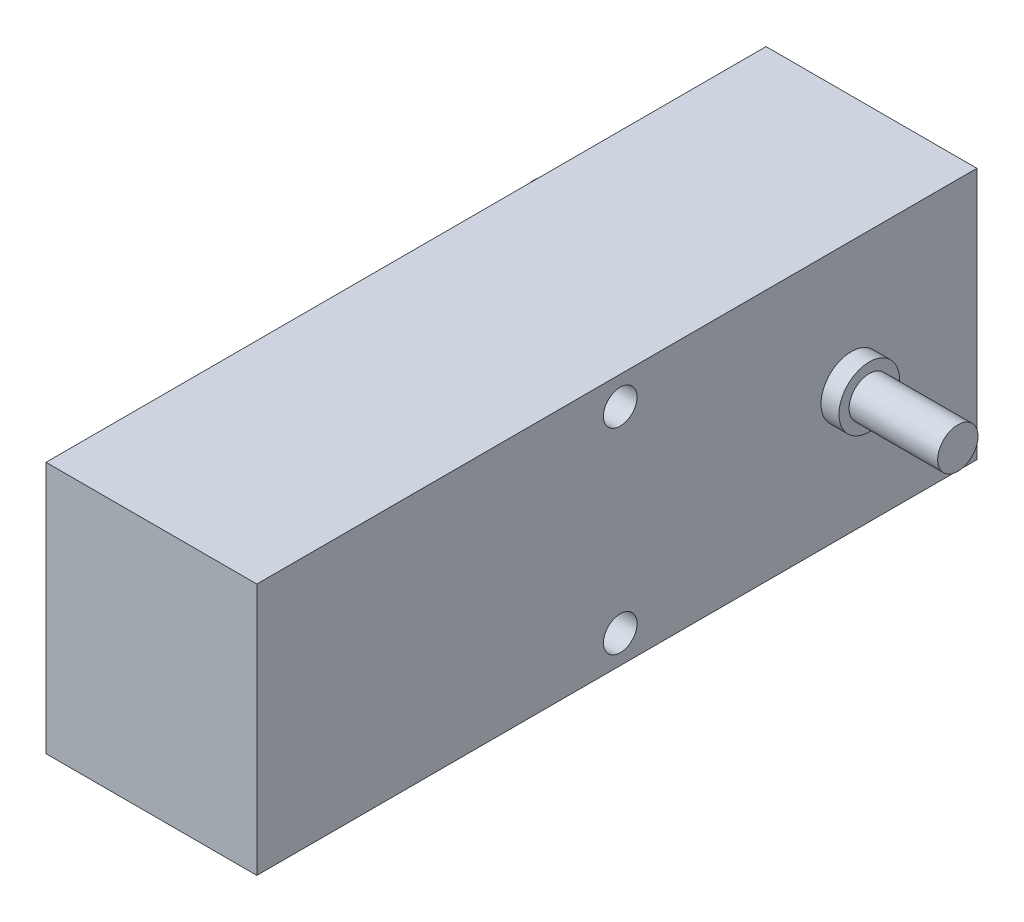
ISO-10303-21;
HEADER;
FILE_DESCRIPTION(('STEP AP214'),'2;1');
FILE_NAME('part.step','',(''),(''),'','','');
FILE_SCHEMA(('AUTOMOTIVE_DESIGN { 1 0 10303 214 1 1 1 1 }'));
ENDSEC;
DATA;
#1=APPLICATION_CONTEXT('core data for automotive mechanical design processes');
#2=APPLICATION_PROTOCOL_DEFINITION('international standard','automotive_design',2000,#1);
#3=PRODUCT_CONTEXT('',#1,'mechanical');
#4=PRODUCT('Part','Part','',(#3));
#5=PRODUCT_RELATED_PRODUCT_CATEGORY('part','',(#4));
#6=PRODUCT_DEFINITION_FORMATION('','',#4);
#7=PRODUCT_DEFINITION_CONTEXT('part definition',#1,'design');
#8=PRODUCT_DEFINITION('design','',#6,#7);
#9=PRODUCT_DEFINITION_SHAPE('','',#8);
#10=(LENGTH_UNIT() NAMED_UNIT(*) SI_UNIT(.MILLI.,.METRE.));
#11=(NAMED_UNIT(*) PLANE_ANGLE_UNIT() SI_UNIT($,.RADIAN.));
#12=(NAMED_UNIT(*) SI_UNIT($,.STERADIAN.) SOLID_ANGLE_UNIT());
#13=UNCERTAINTY_MEASURE_WITH_UNIT(LENGTH_MEASURE(1.E-05),#10,'distance_accuracy_value','');
#14=(GEOMETRIC_REPRESENTATION_CONTEXT(3) GLOBAL_UNCERTAINTY_ASSIGNED_CONTEXT((#13)) GLOBAL_UNIT_ASSIGNED_CONTEXT((#10,
#11,#12)) REPRESENTATION_CONTEXT('',''));
#15=CARTESIAN_POINT('',(0.,0.,0.));
#16=DIRECTION('',(0.,0.,1.));
#17=DIRECTION('',(1.,0.,0.));
#18=AXIS2_PLACEMENT_3D('',#15,#16,#17);
#19=CARTESIAN_POINT('',(9.4,11.25,-32.1));
#20=DIRECTION('',(0.,0.,1.));
#21=DIRECTION('',(1.,0.,0.));
#22=AXIS2_PLACEMENT_3D('',#19,#20,#21);
#23=PLANE('',#22);
#24=DIRECTION('',(-1.,0.,0.));
#25=VECTOR('',#24,1.);
#26=CARTESIAN_POINT('',(2.5,2.5,-32.1));
#27=LINE('',#26,#25);
#28=CARTESIAN_POINT('',(2.5,2.5,-32.1));
#29=VERTEX_POINT('',#28);
#30=CARTESIAN_POINT('',(-2.5,2.5,-32.1));
#31=VERTEX_POINT('',#30);
#32=EDGE_CURVE('E244',#29,#31,#27,.T.);
#33=ORIENTED_EDGE('',*,*,#32,.T.);
#34=DIRECTION('',(0.,-1.,0.));
#35=VECTOR('',#34,1.);
#36=CARTESIAN_POINT('',(-2.5,-2.5,-32.1));
#37=LINE('',#36,#35);
#38=CARTESIAN_POINT('',(-2.5,-2.5,-32.1));
#39=VERTEX_POINT('',#38);
#40=EDGE_CURVE('E60',#31,#39,#37,.T.);
#41=ORIENTED_EDGE('',*,*,#40,.T.);
#42=DIRECTION('',(-1.,0.,0.));
#43=VECTOR('',#42,1.);
#44=CARTESIAN_POINT('',(2.5,-2.5,-32.1));
#45=LINE('',#44,#43);
#46=CARTESIAN_POINT('',(2.5,-2.5,-32.1));
#47=VERTEX_POINT('',#46);
#48=EDGE_CURVE('E125',#47,#39,#45,.T.);
#49=ORIENTED_EDGE('',*,*,#48,.F.);
#50=DIRECTION('',(0.,-1.,0.));
#51=VECTOR('',#50,1.);
#52=CARTESIAN_POINT('',(2.5,-2.5,-32.1));
#53=LINE('',#52,#51);
#54=EDGE_CURVE('E132',#29,#47,#53,.T.);
#55=ORIENTED_EDGE('',*,*,#54,.F.);
#56=EDGE_LOOP('',(#33,#41,#49,#55));
#57=FACE_BOUND('',#56,.T.);
#58=DIRECTION('',(0.,1.,0.));
#59=VECTOR('',#58,1.);
#60=CARTESIAN_POINT('',(-9.4,11.25,-32.1));
#61=LINE('',#60,#59);
#62=CARTESIAN_POINT('',(-9.4,-11.25,-32.1));
#63=VERTEX_POINT('',#62);
#64=CARTESIAN_POINT('',(-9.4,11.25,-32.1));
#65=VERTEX_POINT('',#64);
#66=EDGE_CURVE('E181',#63,#65,#61,.T.);
#67=ORIENTED_EDGE('',*,*,#66,.T.);
#68=DIRECTION('',(-1.,0.,0.));
#69=VECTOR('',#68,1.);
#70=CARTESIAN_POINT('',(9.4,11.25,-32.1));
#71=LINE('',#70,#69);
#72=CARTESIAN_POINT('',(9.4,11.25,-32.1));
#73=VERTEX_POINT('',#72);
#74=EDGE_CURVE('E52',#73,#65,#71,.T.);
#75=ORIENTED_EDGE('',*,*,#74,.F.);
#76=DIRECTION('',(0.,1.,0.));
#77=VECTOR('',#76,1.);
#78=CARTESIAN_POINT('',(9.4,11.25,-32.1));
#79=LINE('',#78,#77);
#80=CARTESIAN_POINT('',(9.4,-11.25,-32.1));
#81=VERTEX_POINT('',#80);
#82=EDGE_CURVE('E182',#81,#73,#79,.T.);
#83=ORIENTED_EDGE('',*,*,#82,.F.);
#84=DIRECTION('',(-1.,0.,0.));
#85=VECTOR('',#84,1.);
#86=CARTESIAN_POINT('',(9.4,-11.25,-32.1));
#87=LINE('',#86,#85);
#88=EDGE_CURVE('E192',#81,#63,#87,.T.);
#89=ORIENTED_EDGE('',*,*,#88,.T.);
#90=EDGE_LOOP('',(#67,#75,#83,#89));
#91=FACE_BOUND('',#90,.T.);
#92=ADVANCED_FACE('F43',(#57,#91),#23,.F.);
#93=CARTESIAN_POINT('',(9.4,11.25,32.1));
#94=DIRECTION('',(0.,-1.,0.));
#95=DIRECTION('',(0.,0.,-1.));
#96=AXIS2_PLACEMENT_3D('',#93,#94,#95);
#97=PLANE('',#96);
#98=DIRECTION('',(0.,0.,1.));
#99=VECTOR('',#98,1.);
#100=CARTESIAN_POINT('',(-9.4,11.25,32.1));
#101=LINE('',#100,#99);
#102=CARTESIAN_POINT('',(-9.4,11.25,32.1));
#103=VERTEX_POINT('',#102);
#104=EDGE_CURVE('E196',#65,#103,#101,.T.);
#105=ORIENTED_EDGE('',*,*,#104,.T.);
#106=DIRECTION('',(-1.,0.,0.));
#107=VECTOR('',#106,1.);
#108=CARTESIAN_POINT('',(9.4,11.25,32.1));
#109=LINE('',#108,#107);
#110=CARTESIAN_POINT('',(9.4,11.25,32.1));
#111=VERTEX_POINT('',#110);
#112=EDGE_CURVE('E209',#111,#103,#109,.T.);
#113=ORIENTED_EDGE('',*,*,#112,.F.);
#114=DIRECTION('',(0.,0.,1.));
#115=VECTOR('',#114,1.);
#116=CARTESIAN_POINT('',(9.4,11.25,32.1));
#117=LINE('',#116,#115);
#118=EDGE_CURVE('E98',#73,#111,#117,.T.);
#119=ORIENTED_EDGE('',*,*,#118,.F.);
#120=ORIENTED_EDGE('',*,*,#74,.T.);
#121=EDGE_LOOP('',(#105,#113,#119,#120));
#122=FACE_BOUND('',#121,.T.);
#123=ADVANCED_FACE('F276',(#122),#97,.F.);
#124=CARTESIAN_POINT('',(9.4,11.25,32.1));
#125=DIRECTION('',(0.,0.,-1.));
#126=DIRECTION('',(-1.,0.,0.));
#127=AXIS2_PLACEMENT_3D('',#124,#125,#126);
#128=PLANE('',#127);
#129=DIRECTION('',(0.,-1.,0.));
#130=VECTOR('',#129,1.);
#131=CARTESIAN_POINT('',(-9.4,11.25,32.1));
#132=LINE('',#131,#130);
#133=CARTESIAN_POINT('',(-9.4,-11.25,32.1));
#134=VERTEX_POINT('',#133);
#135=EDGE_CURVE('E199',#103,#134,#132,.T.);
#136=ORIENTED_EDGE('',*,*,#135,.T.);
#137=DIRECTION('',(-1.,0.,0.));
#138=VECTOR('',#137,1.);
#139=CARTESIAN_POINT('',(9.4,-11.25,32.1));
#140=LINE('',#139,#138);
#141=CARTESIAN_POINT('',(9.4,-11.25,32.1));
#142=VERTEX_POINT('',#141);
#143=EDGE_CURVE('E206',#142,#134,#140,.T.);
#144=ORIENTED_EDGE('',*,*,#143,.F.);
#145=DIRECTION('',(0.,-1.,0.));
#146=VECTOR('',#145,1.);
#147=CARTESIAN_POINT('',(9.4,11.25,32.1));
#148=LINE('',#147,#146);
#149=EDGE_CURVE('E187',#111,#142,#148,.T.);
#150=ORIENTED_EDGE('',*,*,#149,.F.);
#151=ORIENTED_EDGE('',*,*,#112,.T.);
#152=EDGE_LOOP('',(#136,#144,#150,#151));
#153=FACE_BOUND('',#152,.T.);
#154=ADVANCED_FACE('F280',(#153),#128,.F.);
#155=CARTESIAN_POINT('',(9.4,-11.25,32.1));
#156=DIRECTION('',(0.,1.,0.));
#157=DIRECTION('',(0.,0.,1.));
#158=AXIS2_PLACEMENT_3D('',#155,#156,#157);
#159=PLANE('',#158);
#160=DIRECTION('',(0.,0.,-1.));
#161=VECTOR('',#160,1.);
#162=CARTESIAN_POINT('',(-9.4,-11.25,32.1));
#163=LINE('',#162,#161);
#164=EDGE_CURVE('E90',#134,#63,#163,.T.);
#165=ORIENTED_EDGE('',*,*,#164,.T.);
#166=ORIENTED_EDGE('',*,*,#88,.F.);
#167=DIRECTION('',(0.,0.,-1.));
#168=VECTOR('',#167,1.);
#169=CARTESIAN_POINT('',(9.4,-11.25,32.1));
#170=LINE('',#169,#168);
#171=EDGE_CURVE('E69',#142,#81,#170,.T.);
#172=ORIENTED_EDGE('',*,*,#171,.F.);
#173=ORIENTED_EDGE('',*,*,#143,.T.);
#174=EDGE_LOOP('',(#165,#166,#172,#173));
#175=FACE_BOUND('',#174,.T.);
#176=ADVANCED_FACE('F284',(#175),#159,.F.);
#177=CARTESIAN_POINT('',(9.4,0.,0.));
#178=DIRECTION('',(1.,0.,0.));
#179=DIRECTION('',(0.,0.,-1.));
#180=AXIS2_PLACEMENT_3D('',#177,#178,#179);
#181=PLANE('',#180);
#182=CARTESIAN_POINT('',(9.4,8.75,-0.300000000000002));
#183=DIRECTION('',(1.,0.,0.));
#184=DIRECTION('',(0.,0.,-1.));
#185=AXIS2_PLACEMENT_3D('',#182,#183,#184);
#186=CIRCLE('',#185,1.5);
#187=CARTESIAN_POINT('',(9.4,8.75,-1.8));
#188=VERTEX_POINT('',#187);
#189=EDGE_CURVE('E227',#188,#188,#186,.F.);
#190=ORIENTED_EDGE('',*,*,#189,.T.);
#191=EDGE_LOOP('',(#190));
#192=FACE_BOUND('',#191,.T.);
#193=CARTESIAN_POINT('',(9.4,-8.75,-0.300000000000002));
#194=DIRECTION('',(1.,0.,0.));
#195=DIRECTION('',(0.,0.,-1.));
#196=AXIS2_PLACEMENT_3D('',#193,#194,#195);
#197=CIRCLE('',#196,1.5);
#198=CARTESIAN_POINT('',(9.4,-8.75,-1.8));
#199=VERTEX_POINT('',#198);
#200=EDGE_CURVE('E217',#199,#199,#197,.F.);
#201=ORIENTED_EDGE('',*,*,#200,.T.);
#202=EDGE_LOOP('',(#201));
#203=FACE_BOUND('',#202,.T.);
#204=CARTESIAN_POINT('',(9.4,0.,-20.9));
#205=DIRECTION('',(-1.,0.,0.));
#206=DIRECTION('',(0.,0.,1.));
#207=AXIS2_PLACEMENT_3D('',#204,#205,#206);
#208=CIRCLE('',#207,2.7);
#209=CARTESIAN_POINT('',(9.4,0.,-18.2));
#210=VERTEX_POINT('',#209);
#211=EDGE_CURVE('E165',#210,#210,#208,.T.);
#212=ORIENTED_EDGE('',*,*,#211,.T.);
#213=EDGE_LOOP('',(#212));
#214=FACE_BOUND('',#213,.T.);
#215=ORIENTED_EDGE('',*,*,#82,.T.);
#216=ORIENTED_EDGE('',*,*,#118,.T.);
#217=ORIENTED_EDGE('',*,*,#149,.T.);
#218=ORIENTED_EDGE('',*,*,#171,.T.);
#219=EDGE_LOOP('',(#215,#216,#217,#218));
#220=FACE_BOUND('',#219,.T.);
#221=ADVANCED_FACE('F290',(#192,#203,#214,#220),#181,.T.);
#222=CARTESIAN_POINT('',(-9.4,0.,0.));
#223=DIRECTION('',(1.,0.,0.));
#224=DIRECTION('',(0.,0.,-1.));
#225=AXIS2_PLACEMENT_3D('',#222,#223,#224);
#226=PLANE('',#225);
#227=CARTESIAN_POINT('',(-9.4,8.75,-0.300000000000002));
#228=DIRECTION('',(1.,0.,0.));
#229=DIRECTION('',(0.,0.,-1.));
#230=AXIS2_PLACEMENT_3D('',#227,#228,#229);
#231=CIRCLE('',#230,1.5);
#232=CARTESIAN_POINT('',(-9.4,8.75,-1.8));
#233=VERTEX_POINT('',#232);
#234=EDGE_CURVE('E46',#233,#233,#231,.F.);
#235=ORIENTED_EDGE('',*,*,#234,.F.);
#236=EDGE_LOOP('',(#235));
#237=FACE_BOUND('',#236,.T.);
#238=CARTESIAN_POINT('',(-9.4,-8.75,-0.300000000000002));
#239=DIRECTION('',(1.,0.,0.));
#240=DIRECTION('',(0.,0.,-1.));
#241=AXIS2_PLACEMENT_3D('',#238,#239,#240);
#242=CIRCLE('',#241,1.5);
#243=CARTESIAN_POINT('',(-9.4,-8.75,-1.8));
#244=VERTEX_POINT('',#243);
#245=EDGE_CURVE('E214',#244,#244,#242,.F.);
#246=ORIENTED_EDGE('',*,*,#245,.F.);
#247=EDGE_LOOP('',(#246));
#248=FACE_BOUND('',#247,.T.);
#249=CARTESIAN_POINT('',(-9.4,0.,-20.9));
#250=DIRECTION('',(1.,0.,0.));
#251=DIRECTION('',(0.,0.,-1.));
#252=AXIS2_PLACEMENT_3D('',#249,#250,#251);
#253=CIRCLE('',#252,2.7);
#254=CARTESIAN_POINT('',(-9.4,0.,-23.6));
#255=VERTEX_POINT('',#254);
#256=EDGE_CURVE('E11',#255,#255,#253,.F.);
#257=ORIENTED_EDGE('',*,*,#256,.F.);
#258=EDGE_LOOP('',(#257));
#259=FACE_BOUND('',#258,.T.);
#260=ORIENTED_EDGE('',*,*,#66,.F.);
#261=ORIENTED_EDGE('',*,*,#164,.F.);
#262=ORIENTED_EDGE('',*,*,#135,.F.);
#263=ORIENTED_EDGE('',*,*,#104,.F.);
#264=EDGE_LOOP('',(#260,#261,#262,#263));
#265=FACE_BOUND('',#264,.T.);
#266=ADVANCED_FACE('F291',(#237,#248,#259,#265),#226,.F.);
#267=CARTESIAN_POINT('',(18.9,0.,-20.9));
#268=DIRECTION('',(-1.,0.,0.));
#269=DIRECTION('',(0.,0.,1.));
#270=AXIS2_PLACEMENT_3D('',#267,#268,#269);
#271=PLANE('',#270);
#272=CARTESIAN_POINT('',(18.9,0.,-20.9));
#273=DIRECTION('',(-1.,0.,0.));
#274=DIRECTION('',(0.,0.,1.));
#275=AXIS2_PLACEMENT_3D('',#272,#273,#274);
#276=CIRCLE('',#275,1.8);
#277=CARTESIAN_POINT('',(18.9,0.,-19.1));
#278=VERTEX_POINT('',#277);
#279=EDGE_CURVE('E177',#278,#278,#276,.T.);
#280=ORIENTED_EDGE('',*,*,#279,.F.);
#281=EDGE_LOOP('',(#280));
#282=FACE_BOUND('',#281,.T.);
#283=ADVANCED_FACE('F294',(#282),#271,.F.);
#284=CARTESIAN_POINT('',(0.,0.,-20.9));
#285=DIRECTION('',(-1.,0.,0.));
#286=DIRECTION('',(0.,0.,1.));
#287=AXIS2_PLACEMENT_3D('',#284,#285,#286);
#288=CYLINDRICAL_SURFACE('',#287,1.8);
#289=CARTESIAN_POINT('',(11.,0.,-20.9));
#290=DIRECTION('',(-1.,0.,0.));
#291=DIRECTION('',(0.,0.,1.));
#292=AXIS2_PLACEMENT_3D('',#289,#290,#291);
#293=CIRCLE('',#292,1.8);
#294=CARTESIAN_POINT('',(11.,0.,-19.1));
#295=VERTEX_POINT('',#294);
#296=EDGE_CURVE('E173',#295,#295,#293,.T.);
#297=ORIENTED_EDGE('',*,*,#296,.F.);
#298=EDGE_LOOP('',(#297));
#299=FACE_BOUND('',#298,.T.);
#300=ORIENTED_EDGE('',*,*,#279,.T.);
#301=EDGE_LOOP('',(#300));
#302=FACE_BOUND('',#301,.T.);
#303=ADVANCED_FACE('F301',(#299,#302),#288,.T.);
#304=CARTESIAN_POINT('',(11.,0.,-22.7));
#305=DIRECTION('',(-1.,0.,0.));
#306=DIRECTION('',(0.,0.,1.));
#307=AXIS2_PLACEMENT_3D('',#304,#305,#306);
#308=PLANE('',#307);
#309=CARTESIAN_POINT('',(11.,0.,-20.9));
#310=DIRECTION('',(-1.,0.,0.));
#311=DIRECTION('',(0.,0.,1.));
#312=AXIS2_PLACEMENT_3D('',#309,#310,#311);
#313=CIRCLE('',#312,2.7);
#314=CARTESIAN_POINT('',(11.,0.,-18.2));
#315=VERTEX_POINT('',#314);
#316=EDGE_CURVE('E169',#315,#315,#313,.T.);
#317=ORIENTED_EDGE('',*,*,#316,.F.);
#318=EDGE_LOOP('',(#317));
#319=FACE_BOUND('',#318,.T.);
#320=ORIENTED_EDGE('',*,*,#296,.T.);
#321=EDGE_LOOP('',(#320));
#322=FACE_BOUND('',#321,.T.);
#323=ADVANCED_FACE('F305',(#319,#322),#308,.F.);
#324=CARTESIAN_POINT('',(0.,0.,-20.9));
#325=DIRECTION('',(-1.,0.,0.));
#326=DIRECTION('',(0.,0.,1.));
#327=AXIS2_PLACEMENT_3D('',#324,#325,#326);
#328=CYLINDRICAL_SURFACE('',#327,2.7);
#329=ORIENTED_EDGE('',*,*,#211,.F.);
#330=EDGE_LOOP('',(#329));
#331=FACE_BOUND('',#330,.T.);
#332=ORIENTED_EDGE('',*,*,#316,.T.);
#333=EDGE_LOOP('',(#332));
#334=FACE_BOUND('',#333,.T.);
#335=ADVANCED_FACE('F309',(#331,#334),#328,.T.);
#336=CARTESIAN_POINT('',(0.,0.,-20.9));
#337=DIRECTION('',(-1.,0.,0.));
#338=DIRECTION('',(0.,0.,1.));
#339=AXIS2_PLACEMENT_3D('',#336,#337,#338);
#340=CYLINDRICAL_SURFACE('',#339,2.7);
#341=CARTESIAN_POINT('',(-11.,0.,-20.9));
#342=DIRECTION('',(-1.,0.,0.));
#343=DIRECTION('',(0.,0.,1.));
#344=AXIS2_PLACEMENT_3D('',#341,#342,#343);
#345=CIRCLE('',#344,2.7);
#346=CARTESIAN_POINT('',(-11.,0.,-18.2));
#347=VERTEX_POINT('',#346);
#348=EDGE_CURVE('E147',#347,#347,#345,.T.);
#349=ORIENTED_EDGE('',*,*,#348,.F.);
#350=EDGE_LOOP('',(#349));
#351=FACE_BOUND('',#350,.T.);
#352=ORIENTED_EDGE('',*,*,#256,.T.);
#353=EDGE_LOOP('',(#352));
#354=FACE_BOUND('',#353,.T.);
#355=ADVANCED_FACE('F313',(#351,#354),#340,.T.);
#356=CARTESIAN_POINT('',(-18.9,0.,-20.9));
#357=DIRECTION('',(1.,0.,0.));
#358=DIRECTION('',(0.,0.,-1.));
#359=AXIS2_PLACEMENT_3D('',#356,#357,#358);
#360=PLANE('',#359);
#361=CARTESIAN_POINT('',(-18.9,0.,-20.9));
#362=DIRECTION('',(-1.,0.,0.));
#363=DIRECTION('',(0.,0.,1.));
#364=AXIS2_PLACEMENT_3D('',#361,#362,#363);
#365=CIRCLE('',#364,1.8);
#366=CARTESIAN_POINT('',(-18.9,0.,-19.1));
#367=VERTEX_POINT('',#366);
#368=EDGE_CURVE('E161',#367,#367,#365,.T.);
#369=ORIENTED_EDGE('',*,*,#368,.T.);
#370=EDGE_LOOP('',(#369));
#371=FACE_BOUND('',#370,.T.);
#372=ADVANCED_FACE('F317',(#371),#360,.F.);
#373=CARTESIAN_POINT('',(0.,0.,-20.9));
#374=DIRECTION('',(-1.,0.,0.));
#375=DIRECTION('',(0.,0.,1.));
#376=AXIS2_PLACEMENT_3D('',#373,#374,#375);
#377=CYLINDRICAL_SURFACE('',#376,1.8);
#378=ORIENTED_EDGE('',*,*,#368,.F.);
#379=EDGE_LOOP('',(#378));
#380=FACE_BOUND('',#379,.T.);
#381=CARTESIAN_POINT('',(-11.,0.,-20.9));
#382=DIRECTION('',(-1.,0.,0.));
#383=DIRECTION('',(0.,0.,1.));
#384=AXIS2_PLACEMENT_3D('',#381,#382,#383);
#385=CIRCLE('',#384,1.8);
#386=CARTESIAN_POINT('',(-11.,0.,-19.1));
#387=VERTEX_POINT('',#386);
#388=EDGE_CURVE('E152',#387,#387,#385,.T.);
#389=ORIENTED_EDGE('',*,*,#388,.T.);
#390=EDGE_LOOP('',(#389));
#391=FACE_BOUND('',#390,.T.);
#392=ADVANCED_FACE('F321',(#380,#391),#377,.T.);
#393=CARTESIAN_POINT('',(-11.,0.,-22.7));
#394=DIRECTION('',(1.,0.,0.));
#395=DIRECTION('',(0.,0.,-1.));
#396=AXIS2_PLACEMENT_3D('',#393,#394,#395);
#397=PLANE('',#396);
#398=ORIENTED_EDGE('',*,*,#388,.F.);
#399=EDGE_LOOP('',(#398));
#400=FACE_BOUND('',#399,.T.);
#401=ORIENTED_EDGE('',*,*,#348,.T.);
#402=EDGE_LOOP('',(#401));
#403=FACE_BOUND('',#402,.T.);
#404=ADVANCED_FACE('F325',(#400,#403),#397,.F.);
#405=CARTESIAN_POINT('',(2.5,0.,0.));
#406=DIRECTION('',(1.,0.,0.));
#407=DIRECTION('',(0.,0.,-1.));
#408=AXIS2_PLACEMENT_3D('',#405,#406,#407);
#409=PLANE('',#408);
#410=ORIENTED_EDGE('',*,*,#54,.T.);
#411=DIRECTION('',(0.,0.,-1.));
#412=VECTOR('',#411,1.);
#413=CARTESIAN_POINT('',(2.5,-2.5,-37.1));
#414=LINE('',#413,#412);
#415=CARTESIAN_POINT('',(2.5,-2.5,-37.1));
#416=VERTEX_POINT('',#415);
#417=EDGE_CURVE('E121',#47,#416,#414,.T.);
#418=ORIENTED_EDGE('',*,*,#417,.T.);
#419=DIRECTION('',(0.,1.,0.));
#420=VECTOR('',#419,1.);
#421=CARTESIAN_POINT('',(2.5,-2.5,-37.1));
#422=LINE('',#421,#420);
#423=CARTESIAN_POINT('',(2.5,2.5,-37.1));
#424=VERTEX_POINT('',#423);
#425=EDGE_CURVE('E131',#416,#424,#422,.T.);
#426=ORIENTED_EDGE('',*,*,#425,.T.);
#427=DIRECTION('',(0.,0.,1.));
#428=VECTOR('',#427,1.);
#429=CARTESIAN_POINT('',(2.5,2.5,-37.1));
#430=LINE('',#429,#428);
#431=EDGE_CURVE('E138',#424,#29,#430,.T.);
#432=ORIENTED_EDGE('',*,*,#431,.T.);
#433=EDGE_LOOP('',(#410,#418,#426,#432));
#434=FACE_BOUND('',#433,.T.);
#435=CARTESIAN_POINT('',(2.5,0.,-34.7));
#436=DIRECTION('',(1.,0.,0.));
#437=DIRECTION('',(0.,0.,-1.));
#438=AXIS2_PLACEMENT_3D('',#435,#436,#437);
#439=CIRCLE('',#438,1.4);
#440=CARTESIAN_POINT('',(2.5,0.,-36.1));
#441=VERTEX_POINT('',#440);
#442=EDGE_CURVE('E233',#441,#441,#439,.T.);
#443=ORIENTED_EDGE('',*,*,#442,.F.);
#444=EDGE_LOOP('',(#443));
#445=FACE_BOUND('',#444,.T.);
#446=ADVANCED_FACE('F135',(#434,#445),#409,.T.);
#447=CARTESIAN_POINT('',(-2.5,0.,0.));
#448=DIRECTION('',(1.,0.,0.));
#449=DIRECTION('',(0.,0.,-1.));
#450=AXIS2_PLACEMENT_3D('',#447,#448,#449);
#451=PLANE('',#450);
#452=ORIENTED_EDGE('',*,*,#40,.F.);
#453=DIRECTION('',(0.,0.,1.));
#454=VECTOR('',#453,1.);
#455=CARTESIAN_POINT('',(-2.5,2.5,-37.1));
#456=LINE('',#455,#454);
#457=CARTESIAN_POINT('',(-2.5,2.5,-37.1));
#458=VERTEX_POINT('',#457);
#459=EDGE_CURVE('E143',#458,#31,#456,.T.);
#460=ORIENTED_EDGE('',*,*,#459,.F.);
#461=DIRECTION('',(0.,1.,0.));
#462=VECTOR('',#461,1.);
#463=CARTESIAN_POINT('',(-2.5,-2.5,-37.1));
#464=LINE('',#463,#462);
#465=CARTESIAN_POINT('',(-2.5,-2.5,-37.1));
#466=VERTEX_POINT('',#465);
#467=EDGE_CURVE('E250',#466,#458,#464,.T.);
#468=ORIENTED_EDGE('',*,*,#467,.F.);
#469=DIRECTION('',(0.,0.,-1.));
#470=VECTOR('',#469,1.);
#471=CARTESIAN_POINT('',(-2.5,-2.5,-37.1));
#472=LINE('',#471,#470);
#473=EDGE_CURVE('E247',#39,#466,#472,.T.);
#474=ORIENTED_EDGE('',*,*,#473,.F.);
#475=EDGE_LOOP('',(#452,#460,#468,#474));
#476=FACE_BOUND('',#475,.T.);
#477=CARTESIAN_POINT('',(-2.5,0.,-34.7));
#478=DIRECTION('',(1.,0.,0.));
#479=DIRECTION('',(0.,0.,-1.));
#480=AXIS2_PLACEMENT_3D('',#477,#478,#479);
#481=CIRCLE('',#480,1.4);
#482=CARTESIAN_POINT('',(-2.5,0.,-36.1));
#483=VERTEX_POINT('',#482);
#484=EDGE_CURVE('E232',#483,#483,#481,.T.);
#485=ORIENTED_EDGE('',*,*,#484,.T.);
#486=EDGE_LOOP('',(#485));
#487=FACE_BOUND('',#486,.T.);
#488=ADVANCED_FACE('F263',(#476,#487),#451,.F.);
#489=CARTESIAN_POINT('',(2.5,-2.5,-37.1));
#490=DIRECTION('',(0.,1.,0.));
#491=DIRECTION('',(0.,0.,1.));
#492=AXIS2_PLACEMENT_3D('',#489,#490,#491);
#493=PLANE('',#492);
#494=ORIENTED_EDGE('',*,*,#473,.T.);
#495=DIRECTION('',(-1.,0.,0.));
#496=VECTOR('',#495,1.);
#497=CARTESIAN_POINT('',(2.5,-2.5,-37.1));
#498=LINE('',#497,#496);
#499=EDGE_CURVE('E127',#416,#466,#498,.T.);
#500=ORIENTED_EDGE('',*,*,#499,.F.);
#501=ORIENTED_EDGE('',*,*,#417,.F.);
#502=ORIENTED_EDGE('',*,*,#48,.T.);
#503=EDGE_LOOP('',(#494,#500,#501,#502));
#504=FACE_BOUND('',#503,.T.);
#505=ADVANCED_FACE('F123',(#504),#493,.F.);
#506=CARTESIAN_POINT('',(2.5,-2.5,-37.1));
#507=DIRECTION('',(0.,0.,1.));
#508=DIRECTION('',(1.,0.,0.));
#509=AXIS2_PLACEMENT_3D('',#506,#507,#508);
#510=PLANE('',#509);
#511=ORIENTED_EDGE('',*,*,#467,.T.);
#512=DIRECTION('',(-1.,0.,0.));
#513=VECTOR('',#512,1.);
#514=CARTESIAN_POINT('',(2.5,2.5,-37.1));
#515=LINE('',#514,#513);
#516=EDGE_CURVE('E154',#424,#458,#515,.T.);
#517=ORIENTED_EDGE('',*,*,#516,.F.);
#518=ORIENTED_EDGE('',*,*,#425,.F.);
#519=ORIENTED_EDGE('',*,*,#499,.T.);
#520=EDGE_LOOP('',(#511,#517,#518,#519));
#521=FACE_BOUND('',#520,.T.);
#522=ADVANCED_FACE('F265',(#521),#510,.F.);
#523=CARTESIAN_POINT('',(2.5,2.5,-37.1));
#524=DIRECTION('',(0.,-1.,0.));
#525=DIRECTION('',(0.,0.,-1.));
#526=AXIS2_PLACEMENT_3D('',#523,#524,#525);
#527=PLANE('',#526);
#528=ORIENTED_EDGE('',*,*,#459,.T.);
#529=ORIENTED_EDGE('',*,*,#32,.F.);
#530=ORIENTED_EDGE('',*,*,#431,.F.);
#531=ORIENTED_EDGE('',*,*,#516,.T.);
#532=EDGE_LOOP('',(#528,#529,#530,#531));
#533=FACE_BOUND('',#532,.T.);
#534=ADVANCED_FACE('F260',(#533),#527,.F.);
#535=CARTESIAN_POINT('',(2.5,0.,-34.7));
#536=DIRECTION('',(-1.,0.,0.));
#537=DIRECTION('',(0.,0.,1.));
#538=AXIS2_PLACEMENT_3D('',#535,#536,#537);
#539=CYLINDRICAL_SURFACE('',#538,1.4);
#540=ORIENTED_EDGE('',*,*,#442,.T.);
#541=EDGE_LOOP('',(#540));
#542=FACE_BOUND('',#541,.T.);
#543=ORIENTED_EDGE('',*,*,#484,.F.);
#544=EDGE_LOOP('',(#543));
#545=FACE_BOUND('',#544,.T.);
#546=ADVANCED_FACE('F272',(#542,#545),#539,.F.);
#547=CARTESIAN_POINT('',(18.9,-8.75,-0.300000000000002));
#548=DIRECTION('',(-1.,0.,0.));
#549=DIRECTION('',(0.,0.,1.));
#550=AXIS2_PLACEMENT_3D('',#547,#548,#549);
#551=CYLINDRICAL_SURFACE('',#550,1.5);
#552=ORIENTED_EDGE('',*,*,#200,.F.);
#553=EDGE_LOOP('',(#552));
#554=FACE_BOUND('',#553,.T.);
#555=ORIENTED_EDGE('',*,*,#245,.T.);
#556=EDGE_LOOP('',(#555));
#557=FACE_BOUND('',#556,.T.);
#558=ADVANCED_FACE('F354',(#554,#557),#551,.F.);
#559=CARTESIAN_POINT('',(18.9,8.75,-0.300000000000002));
#560=DIRECTION('',(-1.,0.,0.));
#561=DIRECTION('',(0.,0.,1.));
#562=AXIS2_PLACEMENT_3D('',#559,#560,#561);
#563=CYLINDRICAL_SURFACE('',#562,1.5);
#564=ORIENTED_EDGE('',*,*,#189,.F.);
#565=EDGE_LOOP('',(#564));
#566=FACE_BOUND('',#565,.T.);
#567=ORIENTED_EDGE('',*,*,#234,.T.);
#568=EDGE_LOOP('',(#567));
#569=FACE_BOUND('',#568,.T.);
#570=ADVANCED_FACE('F358',(#566,#569),#563,.F.);
#571=CLOSED_SHELL('',(#92,#123,#154,#176,#221,#266,#283,#303,#323,#335,#355,#372,#392,#404,#446,
#488,#505,#522,#534,#546,#558,#570));
#572=MANIFOLD_SOLID_BREP('B2',#571);
#573=ADVANCED_BREP_SHAPE_REPRESENTATION('',(#18,#572),#14);
#574=SHAPE_DEFINITION_REPRESENTATION(#9,#573);
ENDSEC;
END-ISO-10303-21;
